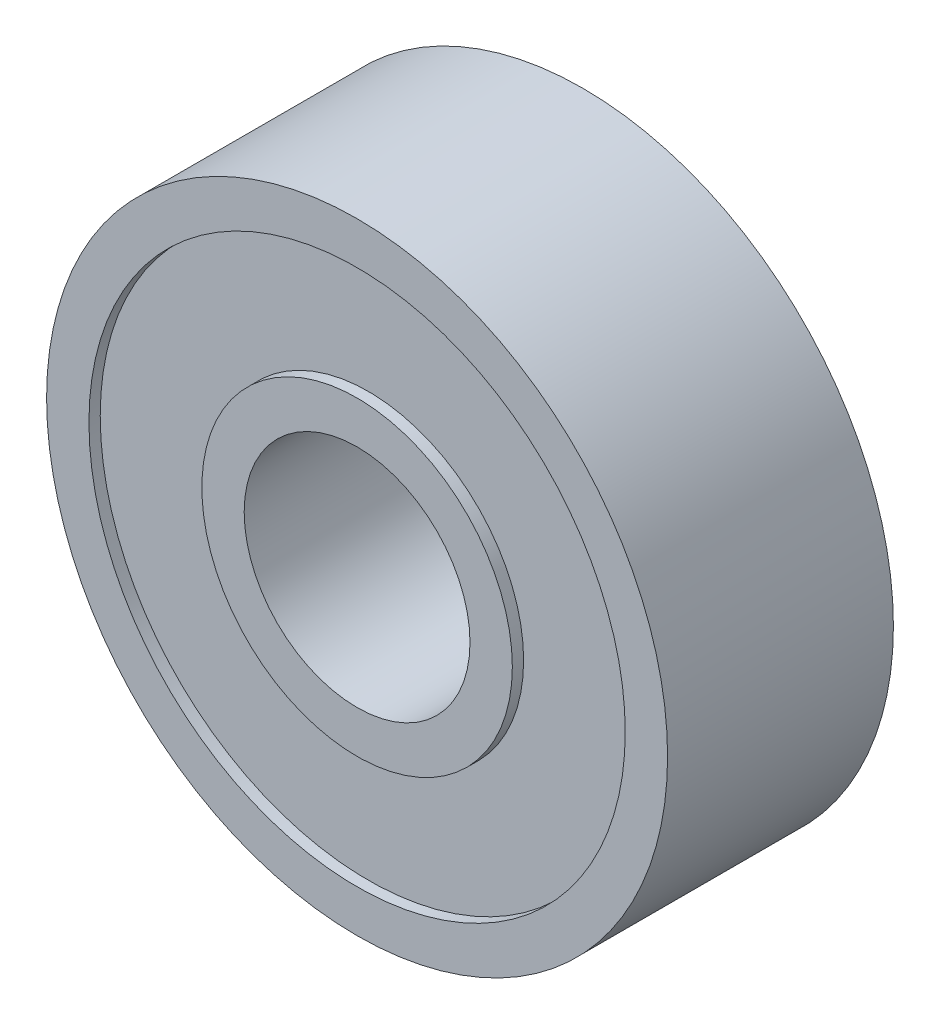
ISO-10303-21;
HEADER;
FILE_DESCRIPTION(('STEP AP214'),'2;1');
FILE_NAME('part.step','',(''),(''),'','','');
FILE_SCHEMA(('AUTOMOTIVE_DESIGN { 1 0 10303 214 1 1 1 1 }'));
ENDSEC;
DATA;
#1=APPLICATION_CONTEXT('core data for automotive mechanical design processes');
#2=APPLICATION_PROTOCOL_DEFINITION('international standard','automotive_design',2000,#1);
#3=PRODUCT_CONTEXT('',#1,'mechanical');
#4=PRODUCT('Part','Part','',(#3));
#5=PRODUCT_RELATED_PRODUCT_CATEGORY('part','',(#4));
#6=PRODUCT_DEFINITION_FORMATION('','',#4);
#7=PRODUCT_DEFINITION_CONTEXT('part definition',#1,'design');
#8=PRODUCT_DEFINITION('design','',#6,#7);
#9=PRODUCT_DEFINITION_SHAPE('','',#8);
#10=(LENGTH_UNIT() NAMED_UNIT(*) SI_UNIT(.MILLI.,.METRE.));
#11=(NAMED_UNIT(*) PLANE_ANGLE_UNIT() SI_UNIT($,.RADIAN.));
#12=(NAMED_UNIT(*) SI_UNIT($,.STERADIAN.) SOLID_ANGLE_UNIT());
#13=UNCERTAINTY_MEASURE_WITH_UNIT(LENGTH_MEASURE(1.E-05),#10,'distance_accuracy_value','');
#14=(GEOMETRIC_REPRESENTATION_CONTEXT(3) GLOBAL_UNCERTAINTY_ASSIGNED_CONTEXT((#13)) GLOBAL_UNIT_ASSIGNED_CONTEXT((#10,
#11,#12)) REPRESENTATION_CONTEXT('',''));
#15=CARTESIAN_POINT('',(0.,0.,0.));
#16=DIRECTION('',(0.,0.,1.));
#17=DIRECTION('',(1.,0.,0.));
#18=AXIS2_PLACEMENT_3D('',#15,#16,#17);
#19=CARTESIAN_POINT('',(0.,0.,0.));
#20=DIRECTION('',(0.,0.,1.));
#21=DIRECTION('',(1.,0.,0.));
#22=AXIS2_PLACEMENT_3D('',#19,#20,#21);
#23=CYLINDRICAL_SURFACE('',#22,2.);
#24=CARTESIAN_POINT('',(0.,0.,4.));
#25=DIRECTION('',(0.,0.,1.));
#26=DIRECTION('',(1.,0.,0.));
#27=AXIS2_PLACEMENT_3D('',#24,#25,#26);
#28=CIRCLE('',#27,2.);
#29=CARTESIAN_POINT('',(2.,0.,4.));
#30=VERTEX_POINT('',#29);
#31=EDGE_CURVE('E18',#30,#30,#28,.F.);
#32=ORIENTED_EDGE('',*,*,#31,.F.);
#33=EDGE_LOOP('',(#32));
#34=FACE_BOUND('',#33,.T.);
#35=CARTESIAN_POINT('',(0.,0.,0.));
#36=DIRECTION('',(0.,0.,1.));
#37=DIRECTION('',(1.,0.,0.));
#38=AXIS2_PLACEMENT_3D('',#35,#36,#37);
#39=CIRCLE('',#38,2.);
#40=CARTESIAN_POINT('',(2.,0.,0.));
#41=VERTEX_POINT('',#40);
#42=EDGE_CURVE('E52',#41,#41,#39,.F.);
#43=ORIENTED_EDGE('',*,*,#42,.T.);
#44=EDGE_LOOP('',(#43));
#45=FACE_BOUND('',#44,.T.);
#46=ADVANCED_FACE('F15',(#34,#45),#23,.F.);
#47=CARTESIAN_POINT('',(0.,0.,4.));
#48=DIRECTION('',(0.,0.,1.));
#49=DIRECTION('',(1.,0.,0.));
#50=AXIS2_PLACEMENT_3D('',#47,#48,#49);
#51=PLANE('',#50);
#52=ORIENTED_EDGE('',*,*,#31,.T.);
#53=EDGE_LOOP('',(#52));
#54=FACE_BOUND('',#53,.T.);
#55=CARTESIAN_POINT('',(0.,0.,4.));
#56=DIRECTION('',(0.,0.,1.));
#57=DIRECTION('',(1.,0.,0.));
#58=AXIS2_PLACEMENT_3D('',#55,#56,#57);
#59=CIRCLE('',#58,2.75);
#60=CARTESIAN_POINT('',(2.75,0.,4.));
#61=VERTEX_POINT('',#60);
#62=EDGE_CURVE('E50',#61,#61,#59,.F.);
#63=ORIENTED_EDGE('',*,*,#62,.F.);
#64=EDGE_LOOP('',(#63));
#65=FACE_BOUND('',#64,.T.);
#66=ADVANCED_FACE('F59',(#54,#65),#51,.T.);
#67=CARTESIAN_POINT('',(0.,0.,0.));
#68=DIRECTION('',(0.,0.,1.));
#69=DIRECTION('',(1.,0.,0.));
#70=AXIS2_PLACEMENT_3D('',#67,#68,#69);
#71=PLANE('',#70);
#72=ORIENTED_EDGE('',*,*,#42,.F.);
#73=EDGE_LOOP('',(#72));
#74=FACE_BOUND('',#73,.T.);
#75=CARTESIAN_POINT('',(0.,0.,0.));
#76=DIRECTION('',(0.,0.,-1.));
#77=DIRECTION('',(-1.,0.,0.));
#78=AXIS2_PLACEMENT_3D('',#75,#76,#77);
#79=CIRCLE('',#78,2.75);
#80=CARTESIAN_POINT('',(-2.75,0.,0.));
#81=VERTEX_POINT('',#80);
#82=EDGE_CURVE('E47',#81,#81,#79,.F.);
#83=ORIENTED_EDGE('',*,*,#82,.F.);
#84=EDGE_LOOP('',(#83));
#85=FACE_BOUND('',#84,.T.);
#86=ADVANCED_FACE('F67',(#74,#85),#71,.F.);
#87=CARTESIAN_POINT('',(0.,0.,4.));
#88=DIRECTION('',(0.,0.,1.));
#89=DIRECTION('',(1.,0.,0.));
#90=AXIS2_PLACEMENT_3D('',#87,#88,#89);
#91=CYLINDRICAL_SURFACE('',#90,2.75);
#92=CARTESIAN_POINT('',(0.,0.,3.8));
#93=DIRECTION('',(0.,0.,1.));
#94=DIRECTION('',(1.,0.,0.));
#95=AXIS2_PLACEMENT_3D('',#92,#93,#94);
#96=CIRCLE('',#95,2.75);
#97=CARTESIAN_POINT('',(2.75,0.,3.8));
#98=VERTEX_POINT('',#97);
#99=EDGE_CURVE('E44',#98,#98,#96,.F.);
#100=ORIENTED_EDGE('',*,*,#99,.F.);
#101=EDGE_LOOP('',(#100));
#102=FACE_BOUND('',#101,.T.);
#103=ORIENTED_EDGE('',*,*,#62,.T.);
#104=EDGE_LOOP('',(#103));
#105=FACE_BOUND('',#104,.T.);
#106=ADVANCED_FACE('F102',(#102,#105),#91,.T.);
#107=CARTESIAN_POINT('',(0.,0.,0.));
#108=DIRECTION('',(0.,0.,-1.));
#109=DIRECTION('',(-1.,0.,0.));
#110=AXIS2_PLACEMENT_3D('',#107,#108,#109);
#111=CYLINDRICAL_SURFACE('',#110,2.75);
#112=CARTESIAN_POINT('',(0.,0.,0.2));
#113=DIRECTION('',(0.,0.,-1.));
#114=DIRECTION('',(-1.,0.,0.));
#115=AXIS2_PLACEMENT_3D('',#112,#113,#114);
#116=CIRCLE('',#115,2.75);
#117=CARTESIAN_POINT('',(-2.75,0.,0.2));
#118=VERTEX_POINT('',#117);
#119=EDGE_CURVE('E41',#118,#118,#116,.F.);
#120=ORIENTED_EDGE('',*,*,#119,.F.);
#121=EDGE_LOOP('',(#120));
#122=FACE_BOUND('',#121,.T.);
#123=ORIENTED_EDGE('',*,*,#82,.T.);
#124=EDGE_LOOP('',(#123));
#125=FACE_BOUND('',#124,.T.);
#126=ADVANCED_FACE('F98',(#122,#125),#111,.T.);
#127=CARTESIAN_POINT('',(0.,0.,3.8));
#128=DIRECTION('',(0.,0.,1.));
#129=DIRECTION('',(1.,0.,0.));
#130=AXIS2_PLACEMENT_3D('',#127,#128,#129);
#131=PLANE('',#130);
#132=ORIENTED_EDGE('',*,*,#99,.T.);
#133=EDGE_LOOP('',(#132));
#134=FACE_BOUND('',#133,.T.);
#135=CARTESIAN_POINT('',(0.,0.,3.8));
#136=DIRECTION('',(0.,0.,1.));
#137=DIRECTION('',(1.,0.,0.));
#138=AXIS2_PLACEMENT_3D('',#135,#136,#137);
#139=CIRCLE('',#138,4.75);
#140=CARTESIAN_POINT('',(4.75,0.,3.8));
#141=VERTEX_POINT('',#140);
#142=EDGE_CURVE('E38',#141,#141,#139,.T.);
#143=ORIENTED_EDGE('',*,*,#142,.T.);
#144=EDGE_LOOP('',(#143));
#145=FACE_BOUND('',#144,.T.);
#146=ADVANCED_FACE('F94',(#134,#145),#131,.T.);
#147=CARTESIAN_POINT('',(0.,0.,0.2));
#148=DIRECTION('',(0.,0.,-1.));
#149=DIRECTION('',(-1.,0.,0.));
#150=AXIS2_PLACEMENT_3D('',#147,#148,#149);
#151=PLANE('',#150);
#152=ORIENTED_EDGE('',*,*,#119,.T.);
#153=EDGE_LOOP('',(#152));
#154=FACE_BOUND('',#153,.T.);
#155=CARTESIAN_POINT('',(0.,0.,0.2));
#156=DIRECTION('',(0.,0.,-1.));
#157=DIRECTION('',(-1.,0.,0.));
#158=AXIS2_PLACEMENT_3D('',#155,#156,#157);
#159=CIRCLE('',#158,4.75);
#160=CARTESIAN_POINT('',(-4.75,0.,0.2));
#161=VERTEX_POINT('',#160);
#162=EDGE_CURVE('E35',#161,#161,#159,.T.);
#163=ORIENTED_EDGE('',*,*,#162,.T.);
#164=EDGE_LOOP('',(#163));
#165=FACE_BOUND('',#164,.T.);
#166=ADVANCED_FACE('F90',(#154,#165),#151,.T.);
#167=CARTESIAN_POINT('',(0.,0.,4.));
#168=DIRECTION('',(0.,0.,1.));
#169=DIRECTION('',(1.,0.,0.));
#170=AXIS2_PLACEMENT_3D('',#167,#168,#169);
#171=CYLINDRICAL_SURFACE('',#170,4.75);
#172=ORIENTED_EDGE('',*,*,#142,.F.);
#173=EDGE_LOOP('',(#172));
#174=FACE_BOUND('',#173,.T.);
#175=CARTESIAN_POINT('',(0.,0.,4.));
#176=DIRECTION('',(0.,0.,1.));
#177=DIRECTION('',(1.,0.,0.));
#178=AXIS2_PLACEMENT_3D('',#175,#176,#177);
#179=CIRCLE('',#178,4.75);
#180=CARTESIAN_POINT('',(4.75,0.,4.));
#181=VERTEX_POINT('',#180);
#182=EDGE_CURVE('E32',#181,#181,#179,.F.);
#183=ORIENTED_EDGE('',*,*,#182,.F.);
#184=EDGE_LOOP('',(#183));
#185=FACE_BOUND('',#184,.T.);
#186=ADVANCED_FACE('F86',(#174,#185),#171,.F.);
#187=CARTESIAN_POINT('',(0.,0.,0.));
#188=DIRECTION('',(0.,0.,-1.));
#189=DIRECTION('',(-1.,0.,0.));
#190=AXIS2_PLACEMENT_3D('',#187,#188,#189);
#191=CYLINDRICAL_SURFACE('',#190,4.75);
#192=ORIENTED_EDGE('',*,*,#162,.F.);
#193=EDGE_LOOP('',(#192));
#194=FACE_BOUND('',#193,.T.);
#195=CARTESIAN_POINT('',(0.,0.,0.));
#196=DIRECTION('',(0.,0.,-1.));
#197=DIRECTION('',(-1.,0.,0.));
#198=AXIS2_PLACEMENT_3D('',#195,#196,#197);
#199=CIRCLE('',#198,4.75);
#200=CARTESIAN_POINT('',(-4.75,0.,0.));
#201=VERTEX_POINT('',#200);
#202=EDGE_CURVE('E27',#201,#201,#199,.T.);
#203=ORIENTED_EDGE('',*,*,#202,.T.);
#204=EDGE_LOOP('',(#203));
#205=FACE_BOUND('',#204,.T.);
#206=ADVANCED_FACE('F82',(#194,#205),#191,.F.);
#207=CARTESIAN_POINT('',(0.,0.,4.));
#208=DIRECTION('',(0.,0.,1.));
#209=DIRECTION('',(1.,0.,0.));
#210=AXIS2_PLACEMENT_3D('',#207,#208,#209);
#211=PLANE('',#210);
#212=ORIENTED_EDGE('',*,*,#182,.T.);
#213=EDGE_LOOP('',(#212));
#214=FACE_BOUND('',#213,.T.);
#215=CARTESIAN_POINT('',(0.,0.,4.));
#216=DIRECTION('',(0.,0.,1.));
#217=DIRECTION('',(1.,0.,0.));
#218=AXIS2_PLACEMENT_3D('',#215,#216,#217);
#219=CIRCLE('',#218,5.5);
#220=CARTESIAN_POINT('',(5.5,0.,4.));
#221=VERTEX_POINT('',#220);
#222=EDGE_CURVE('E22',#221,#221,#219,.F.);
#223=ORIENTED_EDGE('',*,*,#222,.F.);
#224=EDGE_LOOP('',(#223));
#225=FACE_BOUND('',#224,.T.);
#226=ADVANCED_FACE('F76',(#214,#225),#211,.T.);
#227=CARTESIAN_POINT('',(0.,0.,0.));
#228=DIRECTION('',(0.,0.,1.));
#229=DIRECTION('',(1.,0.,0.));
#230=AXIS2_PLACEMENT_3D('',#227,#228,#229);
#231=PLANE('',#230);
#232=ORIENTED_EDGE('',*,*,#202,.F.);
#233=EDGE_LOOP('',(#232));
#234=FACE_BOUND('',#233,.T.);
#235=CARTESIAN_POINT('',(0.,0.,0.));
#236=DIRECTION('',(0.,0.,1.));
#237=DIRECTION('',(1.,0.,0.));
#238=AXIS2_PLACEMENT_3D('',#235,#236,#237);
#239=CIRCLE('',#238,5.5);
#240=CARTESIAN_POINT('',(5.5,0.,0.));
#241=VERTEX_POINT('',#240);
#242=EDGE_CURVE('E10',#241,#241,#239,.T.);
#243=ORIENTED_EDGE('',*,*,#242,.F.);
#244=EDGE_LOOP('',(#243));
#245=FACE_BOUND('',#244,.T.);
#246=ADVANCED_FACE('F70',(#234,#245),#231,.F.);
#247=CARTESIAN_POINT('',(0.,0.,0.));
#248=DIRECTION('',(0.,0.,1.));
#249=DIRECTION('',(1.,0.,0.));
#250=AXIS2_PLACEMENT_3D('',#247,#248,#249);
#251=CYLINDRICAL_SURFACE('',#250,5.5);
#252=ORIENTED_EDGE('',*,*,#222,.T.);
#253=EDGE_LOOP('',(#252));
#254=FACE_BOUND('',#253,.T.);
#255=ORIENTED_EDGE('',*,*,#242,.T.);
#256=EDGE_LOOP('',(#255));
#257=FACE_BOUND('',#256,.T.);
#258=ADVANCED_FACE('F68',(#254,#257),#251,.T.);
#259=CLOSED_SHELL('',(#46,#66,#86,#106,#126,#146,#166,#186,#206,#226,#246,#258));
#260=MANIFOLD_SOLID_BREP('B1',#259);
#261=ADVANCED_BREP_SHAPE_REPRESENTATION('',(#18,#260),#14);
#262=SHAPE_DEFINITION_REPRESENTATION(#9,#261);
ENDSEC;
END-ISO-10303-21;
